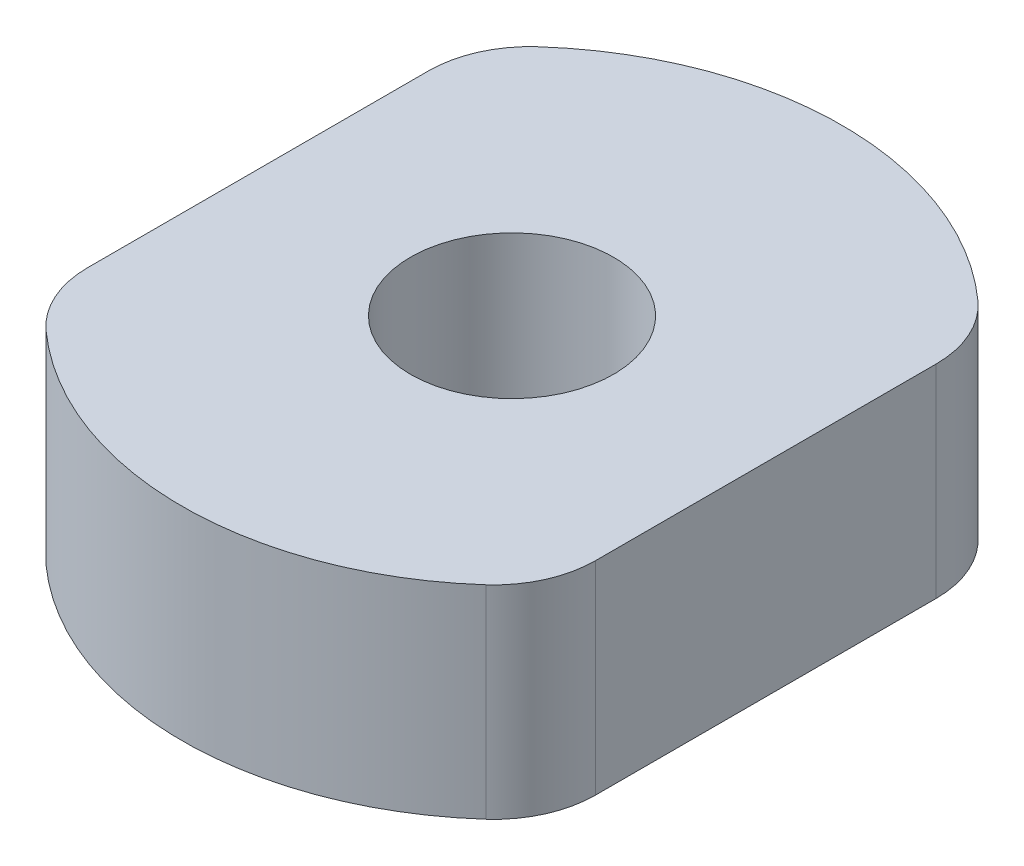
ISO-10303-21;
HEADER;
FILE_DESCRIPTION(('STEP AP214'),'2;1');
FILE_NAME('part.step','',(''),(''),'','','');
FILE_SCHEMA(('AUTOMOTIVE_DESIGN { 1 0 10303 214 1 1 1 1 }'));
ENDSEC;
DATA;
#1=APPLICATION_CONTEXT('core data for automotive mechanical design processes');
#2=APPLICATION_PROTOCOL_DEFINITION('international standard','automotive_design',2000,#1);
#3=PRODUCT_CONTEXT('',#1,'mechanical');
#4=PRODUCT('Part','Part','',(#3));
#5=PRODUCT_RELATED_PRODUCT_CATEGORY('part','',(#4));
#6=PRODUCT_DEFINITION_FORMATION('','',#4);
#7=PRODUCT_DEFINITION_CONTEXT('part definition',#1,'design');
#8=PRODUCT_DEFINITION('design','',#6,#7);
#9=PRODUCT_DEFINITION_SHAPE('','',#8);
#10=(LENGTH_UNIT() NAMED_UNIT(*) SI_UNIT(.MILLI.,.METRE.));
#11=(NAMED_UNIT(*) PLANE_ANGLE_UNIT() SI_UNIT($,.RADIAN.));
#12=(NAMED_UNIT(*) SI_UNIT($,.STERADIAN.) SOLID_ANGLE_UNIT());
#13=UNCERTAINTY_MEASURE_WITH_UNIT(LENGTH_MEASURE(1.E-05),#10,'distance_accuracy_value','');
#14=(GEOMETRIC_REPRESENTATION_CONTEXT(3) GLOBAL_UNCERTAINTY_ASSIGNED_CONTEXT((#13)) GLOBAL_UNIT_ASSIGNED_CONTEXT((#10,
#11,#12)) REPRESENTATION_CONTEXT('',''));
#15=CARTESIAN_POINT('',(0.,0.,0.));
#16=DIRECTION('',(0.,0.,1.));
#17=DIRECTION('',(1.,0.,0.));
#18=AXIS2_PLACEMENT_3D('',#15,#16,#17);
#19=CARTESIAN_POINT('',(-19.05,25.4,21.2985474856855));
#20=DIRECTION('',(0.,1.,0.));
#21=DIRECTION('',(0.,0.,1.));
#22=AXIS2_PLACEMENT_3D('',#19,#20,#21);
#23=PLANE('',#22);
#24=CARTESIAN_POINT('',(-19.05,25.4,21.2985474856855));
#25=DIRECTION('',(0.,1.,0.));
#26=DIRECTION('',(0.,0.,1.));
#27=AXIS2_PLACEMENT_3D('',#24,#25,#26);
#28=CIRCLE('',#27,12.7);
#29=CARTESIAN_POINT('',(-31.75,25.4,21.2985474856855));
#30=VERTEX_POINT('',#29);
#31=CARTESIAN_POINT('',(-27.5166666666667,25.4,30.7645685904346));
#32=VERTEX_POINT('',#31);
#33=EDGE_CURVE('E136',#30,#32,#28,.T.);
#34=ORIENTED_EDGE('',*,*,#33,.T.);
#35=CARTESIAN_POINT('',(0.,25.4,0.));
#36=DIRECTION('',(0.,1.,0.));
#37=DIRECTION('',(0.,0.,1.));
#38=AXIS2_PLACEMENT_3D('',#35,#36,#37);
#39=CIRCLE('',#38,41.275);
#40=CARTESIAN_POINT('',(27.5166666666667,25.4,30.7645685904346));
#41=VERTEX_POINT('',#40);
#42=EDGE_CURVE('E113',#32,#41,#39,.T.);
#43=ORIENTED_EDGE('',*,*,#42,.T.);
#44=CARTESIAN_POINT('',(19.05,25.4,21.2985474856855));
#45=DIRECTION('',(0.,1.,0.));
#46=DIRECTION('',(0.,0.,-1.));
#47=AXIS2_PLACEMENT_3D('',#44,#45,#46);
#48=CIRCLE('',#47,12.7);
#49=CARTESIAN_POINT('',(31.75,25.4,21.2985474856855));
#50=VERTEX_POINT('',#49);
#51=EDGE_CURVE('E139',#41,#50,#48,.T.);
#52=ORIENTED_EDGE('',*,*,#51,.T.);
#53=DIRECTION('',(0.,0.,-1.));
#54=VECTOR('',#53,1.);
#55=CARTESIAN_POINT('',(31.75,25.4,-21.2985474856855));
#56=LINE('',#55,#54);
#57=CARTESIAN_POINT('',(31.75,25.4,-21.2985474856855));
#58=VERTEX_POINT('',#57);
#59=EDGE_CURVE('E141',#50,#58,#56,.T.);
#60=ORIENTED_EDGE('',*,*,#59,.T.);
#61=CARTESIAN_POINT('',(19.05,25.4,-21.2985474856855));
#62=DIRECTION('',(0.,1.,0.));
#63=DIRECTION('',(0.,0.,1.));
#64=AXIS2_PLACEMENT_3D('',#61,#62,#63);
#65=CIRCLE('',#64,12.7);
#66=CARTESIAN_POINT('',(27.5166666666667,25.4,-30.7645685904346));
#67=VERTEX_POINT('',#66);
#68=EDGE_CURVE('E143',#58,#67,#65,.T.);
#69=ORIENTED_EDGE('',*,*,#68,.T.);
#70=CARTESIAN_POINT('',(0.,25.4,0.));
#71=DIRECTION('',(0.,1.,0.));
#72=DIRECTION('',(0.,0.,1.));
#73=AXIS2_PLACEMENT_3D('',#70,#71,#72);
#74=CIRCLE('',#73,41.275);
#75=CARTESIAN_POINT('',(-27.5166666666667,25.4,-30.7645685904346));
#76=VERTEX_POINT('',#75);
#77=EDGE_CURVE('E145',#67,#76,#74,.T.);
#78=ORIENTED_EDGE('',*,*,#77,.T.);
#79=CARTESIAN_POINT('',(-19.05,25.4,-21.2985474856855));
#80=DIRECTION('',(0.,1.,0.));
#81=DIRECTION('',(0.,0.,-1.));
#82=AXIS2_PLACEMENT_3D('',#79,#80,#81);
#83=CIRCLE('',#82,12.7);
#84=CARTESIAN_POINT('',(-31.75,25.4,-21.2985474856855));
#85=VERTEX_POINT('',#84);
#86=EDGE_CURVE('E54',#76,#85,#83,.T.);
#87=ORIENTED_EDGE('',*,*,#86,.T.);
#88=DIRECTION('',(0.,0.,1.));
#89=VECTOR('',#88,1.);
#90=CARTESIAN_POINT('',(-31.75,25.4,-21.2985474856855));
#91=LINE('',#90,#89);
#92=EDGE_CURVE('E49',#85,#30,#91,.T.);
#93=ORIENTED_EDGE('',*,*,#92,.T.);
#94=EDGE_LOOP('',(#34,#43,#52,#60,#69,#78,#87,#93));
#95=FACE_BOUND('',#94,.T.);
#96=CARTESIAN_POINT('',(0.,25.4,0.));
#97=DIRECTION('',(0.,1.,0.));
#98=DIRECTION('',(0.,0.,1.));
#99=AXIS2_PLACEMENT_3D('',#96,#97,#98);
#100=CIRCLE('',#99,12.7);
#101=CARTESIAN_POINT('',(0.,25.4,12.7));
#102=VERTEX_POINT('',#101);
#103=EDGE_CURVE('E118',#102,#102,#100,.T.);
#104=ORIENTED_EDGE('',*,*,#103,.F.);
#105=EDGE_LOOP('',(#104));
#106=FACE_BOUND('',#105,.T.);
#107=ADVANCED_FACE('F34',(#95,#106),#23,.T.);
#108=CARTESIAN_POINT('',(-19.05,0.,21.2985474856855));
#109=DIRECTION('',(0.,1.,0.));
#110=DIRECTION('',(0.,0.,1.));
#111=AXIS2_PLACEMENT_3D('',#108,#109,#110);
#112=PLANE('',#111);
#113=CARTESIAN_POINT('',(-19.05,0.,21.2985474856855));
#114=DIRECTION('',(0.,1.,0.));
#115=DIRECTION('',(0.,0.,1.));
#116=AXIS2_PLACEMENT_3D('',#113,#114,#115);
#117=CIRCLE('',#116,12.7);
#118=CARTESIAN_POINT('',(-31.75,0.,21.2985474856855));
#119=VERTEX_POINT('',#118);
#120=CARTESIAN_POINT('',(-27.5166666666667,0.,30.7645685904346));
#121=VERTEX_POINT('',#120);
#122=EDGE_CURVE('E104',#119,#121,#117,.T.);
#123=ORIENTED_EDGE('',*,*,#122,.F.);
#124=DIRECTION('',(0.,0.,1.));
#125=VECTOR('',#124,1.);
#126=CARTESIAN_POINT('',(-31.75,0.,-21.2985474856855));
#127=LINE('',#126,#125);
#128=CARTESIAN_POINT('',(-31.75,0.,-21.2985474856855));
#129=VERTEX_POINT('',#128);
#130=EDGE_CURVE('E134',#129,#119,#127,.T.);
#131=ORIENTED_EDGE('',*,*,#130,.F.);
#132=CARTESIAN_POINT('',(-19.05,0.,-21.2985474856855));
#133=DIRECTION('',(0.,1.,0.));
#134=DIRECTION('',(0.,0.,-1.));
#135=AXIS2_PLACEMENT_3D('',#132,#133,#134);
#136=CIRCLE('',#135,12.7);
#137=CARTESIAN_POINT('',(-27.5166666666667,0.,-30.7645685904346));
#138=VERTEX_POINT('',#137);
#139=EDGE_CURVE('E132',#138,#129,#136,.T.);
#140=ORIENTED_EDGE('',*,*,#139,.F.);
#141=CARTESIAN_POINT('',(0.,0.,0.));
#142=DIRECTION('',(0.,1.,0.));
#143=DIRECTION('',(0.,0.,1.));
#144=AXIS2_PLACEMENT_3D('',#141,#142,#143);
#145=CIRCLE('',#144,41.275);
#146=CARTESIAN_POINT('',(27.5166666666667,0.,-30.7645685904346));
#147=VERTEX_POINT('',#146);
#148=EDGE_CURVE('E130',#147,#138,#145,.T.);
#149=ORIENTED_EDGE('',*,*,#148,.F.);
#150=CARTESIAN_POINT('',(19.05,0.,-21.2985474856855));
#151=DIRECTION('',(0.,1.,0.));
#152=DIRECTION('',(0.,0.,1.));
#153=AXIS2_PLACEMENT_3D('',#150,#151,#152);
#154=CIRCLE('',#153,12.7);
#155=CARTESIAN_POINT('',(31.75,0.,-21.2985474856855));
#156=VERTEX_POINT('',#155);
#157=EDGE_CURVE('E128',#156,#147,#154,.T.);
#158=ORIENTED_EDGE('',*,*,#157,.F.);
#159=DIRECTION('',(0.,0.,-1.));
#160=VECTOR('',#159,1.);
#161=CARTESIAN_POINT('',(31.75,0.,-21.2985474856855));
#162=LINE('',#161,#160);
#163=CARTESIAN_POINT('',(31.75,0.,21.2985474856855));
#164=VERTEX_POINT('',#163);
#165=EDGE_CURVE('E126',#164,#156,#162,.T.);
#166=ORIENTED_EDGE('',*,*,#165,.F.);
#167=CARTESIAN_POINT('',(19.05,0.,21.2985474856855));
#168=DIRECTION('',(0.,1.,0.));
#169=DIRECTION('',(0.,0.,-1.));
#170=AXIS2_PLACEMENT_3D('',#167,#168,#169);
#171=CIRCLE('',#170,12.7);
#172=CARTESIAN_POINT('',(27.5166666666667,0.,30.7645685904346));
#173=VERTEX_POINT('',#172);
#174=EDGE_CURVE('E106',#173,#164,#171,.T.);
#175=ORIENTED_EDGE('',*,*,#174,.F.);
#176=CARTESIAN_POINT('',(0.,0.,0.));
#177=DIRECTION('',(0.,1.,0.));
#178=DIRECTION('',(0.,0.,1.));
#179=AXIS2_PLACEMENT_3D('',#176,#177,#178);
#180=CIRCLE('',#179,41.275);
#181=EDGE_CURVE('E99',#121,#173,#180,.T.);
#182=ORIENTED_EDGE('',*,*,#181,.F.);
#183=EDGE_LOOP('',(#123,#131,#140,#149,#158,#166,#175,#182));
#184=FACE_BOUND('',#183,.T.);
#185=CARTESIAN_POINT('',(0.,0.,0.));
#186=DIRECTION('',(0.,1.,0.));
#187=DIRECTION('',(0.,0.,1.));
#188=AXIS2_PLACEMENT_3D('',#185,#186,#187);
#189=CIRCLE('',#188,12.7);
#190=CARTESIAN_POINT('',(0.,0.,12.7));
#191=VERTEX_POINT('',#190);
#192=EDGE_CURVE('E121',#191,#191,#189,.T.);
#193=ORIENTED_EDGE('',*,*,#192,.T.);
#194=EDGE_LOOP('',(#193));
#195=FACE_BOUND('',#194,.T.);
#196=ADVANCED_FACE('F100',(#184,#195),#112,.F.);
#197=CARTESIAN_POINT('',(-19.05,25.4,21.2985474856855));
#198=DIRECTION('',(0.,-1.,0.));
#199=DIRECTION('',(0.,0.,-1.));
#200=AXIS2_PLACEMENT_3D('',#197,#198,#199);
#201=CYLINDRICAL_SURFACE('',#200,12.7);
#202=ORIENTED_EDGE('',*,*,#122,.T.);
#203=DIRECTION('',(0.,-1.,0.));
#204=VECTOR('',#203,1.);
#205=CARTESIAN_POINT('',(-27.5166666666667,25.4,30.7645685904346));
#206=LINE('',#205,#204);
#207=EDGE_CURVE('E11',#32,#121,#206,.T.);
#208=ORIENTED_EDGE('',*,*,#207,.F.);
#209=ORIENTED_EDGE('',*,*,#33,.F.);
#210=DIRECTION('',(0.,-1.,0.));
#211=VECTOR('',#210,1.);
#212=CARTESIAN_POINT('',(-31.75,25.4,21.2985474856855));
#213=LINE('',#212,#211);
#214=EDGE_CURVE('E117',#30,#119,#213,.T.);
#215=ORIENTED_EDGE('',*,*,#214,.T.);
#216=EDGE_LOOP('',(#202,#208,#209,#215));
#217=FACE_BOUND('',#216,.T.);
#218=ADVANCED_FACE('F36',(#217),#201,.T.);
#219=CARTESIAN_POINT('',(0.,25.4,0.));
#220=DIRECTION('',(0.,-1.,0.));
#221=DIRECTION('',(0.,0.,-1.));
#222=AXIS2_PLACEMENT_3D('',#219,#220,#221);
#223=CYLINDRICAL_SURFACE('',#222,41.275);
#224=ORIENTED_EDGE('',*,*,#181,.T.);
#225=DIRECTION('',(0.,-1.,0.));
#226=VECTOR('',#225,1.);
#227=CARTESIAN_POINT('',(27.5166666666667,25.4,30.7645685904346));
#228=LINE('',#227,#226);
#229=EDGE_CURVE('E42',#41,#173,#228,.T.);
#230=ORIENTED_EDGE('',*,*,#229,.F.);
#231=ORIENTED_EDGE('',*,*,#42,.F.);
#232=ORIENTED_EDGE('',*,*,#207,.T.);
#233=EDGE_LOOP('',(#224,#230,#231,#232));
#234=FACE_BOUND('',#233,.T.);
#235=ADVANCED_FACE('F112',(#234),#223,.T.);
#236=CARTESIAN_POINT('',(19.05,25.4,21.2985474856855));
#237=DIRECTION('',(0.,-1.,0.));
#238=DIRECTION('',(0.,0.,-1.));
#239=AXIS2_PLACEMENT_3D('',#236,#237,#238);
#240=CYLINDRICAL_SURFACE('',#239,12.7);
#241=ORIENTED_EDGE('',*,*,#174,.T.);
#242=DIRECTION('',(0.,-1.,0.));
#243=VECTOR('',#242,1.);
#244=CARTESIAN_POINT('',(31.75,25.4,21.2985474856855));
#245=LINE('',#244,#243);
#246=EDGE_CURVE('E162',#50,#164,#245,.T.);
#247=ORIENTED_EDGE('',*,*,#246,.F.);
#248=ORIENTED_EDGE('',*,*,#51,.F.);
#249=ORIENTED_EDGE('',*,*,#229,.T.);
#250=EDGE_LOOP('',(#241,#247,#248,#249));
#251=FACE_BOUND('',#250,.T.);
#252=ADVANCED_FACE('F166',(#251),#240,.T.);
#253=CARTESIAN_POINT('',(31.75,25.4,-21.2985474856855));
#254=DIRECTION('',(-1.,0.,0.));
#255=DIRECTION('',(0.,0.,1.));
#256=AXIS2_PLACEMENT_3D('',#253,#254,#255);
#257=PLANE('',#256);
#258=ORIENTED_EDGE('',*,*,#165,.T.);
#259=DIRECTION('',(0.,-1.,0.));
#260=VECTOR('',#259,1.);
#261=CARTESIAN_POINT('',(31.75,25.4,-21.2985474856855));
#262=LINE('',#261,#260);
#263=EDGE_CURVE('E159',#58,#156,#262,.T.);
#264=ORIENTED_EDGE('',*,*,#263,.F.);
#265=ORIENTED_EDGE('',*,*,#59,.F.);
#266=ORIENTED_EDGE('',*,*,#246,.T.);
#267=EDGE_LOOP('',(#258,#264,#265,#266));
#268=FACE_BOUND('',#267,.T.);
#269=ADVANCED_FACE('F174',(#268),#257,.F.);
#270=CARTESIAN_POINT('',(19.05,25.4,-21.2985474856855));
#271=DIRECTION('',(0.,-1.,0.));
#272=DIRECTION('',(0.,0.,-1.));
#273=AXIS2_PLACEMENT_3D('',#270,#271,#272);
#274=CYLINDRICAL_SURFACE('',#273,12.7);
#275=ORIENTED_EDGE('',*,*,#157,.T.);
#276=DIRECTION('',(0.,-1.,0.));
#277=VECTOR('',#276,1.);
#278=CARTESIAN_POINT('',(27.5166666666667,25.4,-30.7645685904346));
#279=LINE('',#278,#277);
#280=EDGE_CURVE('E156',#67,#147,#279,.T.);
#281=ORIENTED_EDGE('',*,*,#280,.F.);
#282=ORIENTED_EDGE('',*,*,#68,.F.);
#283=ORIENTED_EDGE('',*,*,#263,.T.);
#284=EDGE_LOOP('',(#275,#281,#282,#283));
#285=FACE_BOUND('',#284,.T.);
#286=ADVANCED_FACE('F177',(#285),#274,.T.);
#287=CARTESIAN_POINT('',(0.,25.4,0.));
#288=DIRECTION('',(0.,-1.,0.));
#289=DIRECTION('',(0.,0.,-1.));
#290=AXIS2_PLACEMENT_3D('',#287,#288,#289);
#291=CYLINDRICAL_SURFACE('',#290,41.275);
#292=ORIENTED_EDGE('',*,*,#148,.T.);
#293=DIRECTION('',(0.,-1.,0.));
#294=VECTOR('',#293,1.);
#295=CARTESIAN_POINT('',(-27.5166666666667,25.4,-30.7645685904346));
#296=LINE('',#295,#294);
#297=EDGE_CURVE('E153',#76,#138,#296,.T.);
#298=ORIENTED_EDGE('',*,*,#297,.F.);
#299=ORIENTED_EDGE('',*,*,#77,.F.);
#300=ORIENTED_EDGE('',*,*,#280,.T.);
#301=EDGE_LOOP('',(#292,#298,#299,#300));
#302=FACE_BOUND('',#301,.T.);
#303=ADVANCED_FACE('F182',(#302),#291,.T.);
#304=CARTESIAN_POINT('',(-19.05,25.4,-21.2985474856855));
#305=DIRECTION('',(0.,-1.,0.));
#306=DIRECTION('',(0.,0.,-1.));
#307=AXIS2_PLACEMENT_3D('',#304,#305,#306);
#308=CYLINDRICAL_SURFACE('',#307,12.7);
#309=ORIENTED_EDGE('',*,*,#139,.T.);
#310=DIRECTION('',(0.,-1.,0.));
#311=VECTOR('',#310,1.);
#312=CARTESIAN_POINT('',(-31.75,25.4,-21.2985474856855));
#313=LINE('',#312,#311);
#314=EDGE_CURVE('E150',#85,#129,#313,.T.);
#315=ORIENTED_EDGE('',*,*,#314,.F.);
#316=ORIENTED_EDGE('',*,*,#86,.F.);
#317=ORIENTED_EDGE('',*,*,#297,.T.);
#318=EDGE_LOOP('',(#309,#315,#316,#317));
#319=FACE_BOUND('',#318,.T.);
#320=ADVANCED_FACE('F185',(#319),#308,.T.);
#321=CARTESIAN_POINT('',(-31.75,25.4,-21.2985474856855));
#322=DIRECTION('',(1.,0.,0.));
#323=DIRECTION('',(0.,0.,-1.));
#324=AXIS2_PLACEMENT_3D('',#321,#322,#323);
#325=PLANE('',#324);
#326=ORIENTED_EDGE('',*,*,#130,.T.);
#327=ORIENTED_EDGE('',*,*,#214,.F.);
#328=ORIENTED_EDGE('',*,*,#92,.F.);
#329=ORIENTED_EDGE('',*,*,#314,.T.);
#330=EDGE_LOOP('',(#326,#327,#328,#329));
#331=FACE_BOUND('',#330,.T.);
#332=ADVANCED_FACE('F187',(#331),#325,.F.);
#333=CARTESIAN_POINT('',(0.,25.4,0.));
#334=DIRECTION('',(0.,-1.,0.));
#335=DIRECTION('',(0.,0.,-1.));
#336=AXIS2_PLACEMENT_3D('',#333,#334,#335);
#337=CYLINDRICAL_SURFACE('',#336,12.7);
#338=ORIENTED_EDGE('',*,*,#103,.T.);
#339=EDGE_LOOP('',(#338));
#340=FACE_BOUND('',#339,.T.);
#341=ORIENTED_EDGE('',*,*,#192,.F.);
#342=EDGE_LOOP('',(#341));
#343=FACE_BOUND('',#342,.T.);
#344=ADVANCED_FACE('F189',(#340,#343),#337,.F.);
#345=CLOSED_SHELL('',(#107,#196,#218,#235,#252,#269,#286,#303,#320,#332,#344));
#346=MANIFOLD_SOLID_BREP('B2',#345);
#347=ADVANCED_BREP_SHAPE_REPRESENTATION('',(#18,#346),#14);
#348=SHAPE_DEFINITION_REPRESENTATION(#9,#347);
ENDSEC;
END-ISO-10303-21;
